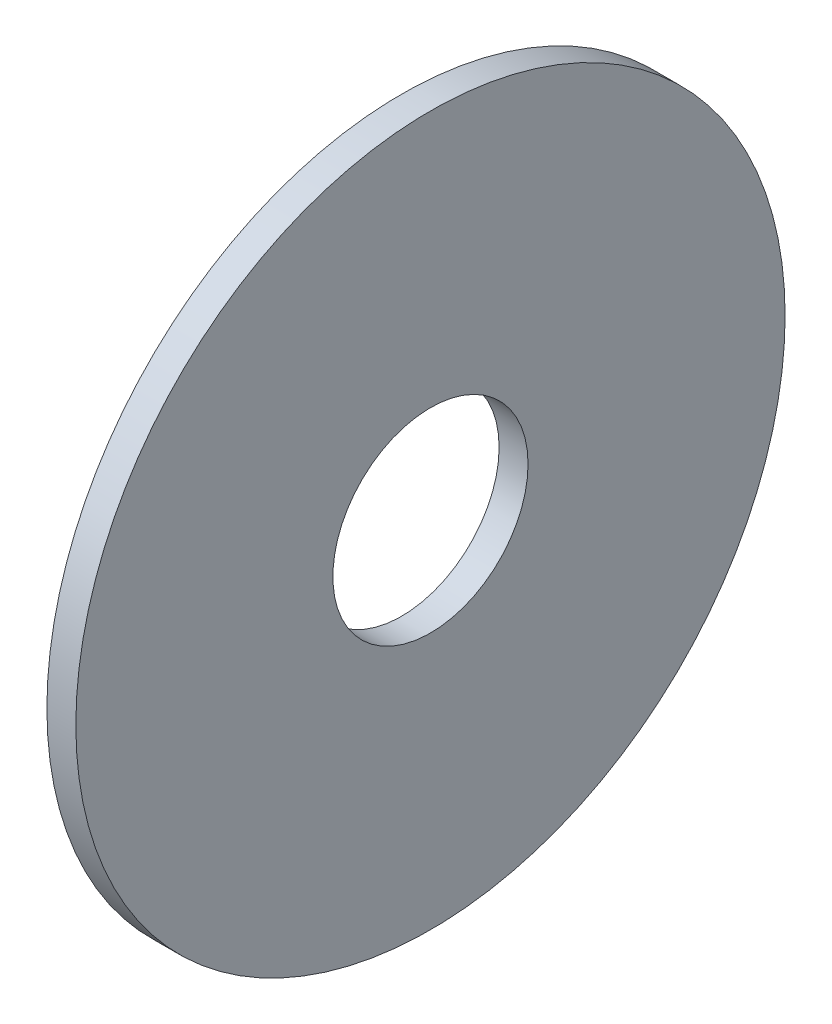
ISO-10303-21;
HEADER;
FILE_DESCRIPTION(('STEP AP214'),'2;1');
FILE_NAME('part.step','',(''),(''),'','','');
FILE_SCHEMA(('AUTOMOTIVE_DESIGN { 1 0 10303 214 1 1 1 1 }'));
ENDSEC;
DATA;
#1=APPLICATION_CONTEXT('core data for automotive mechanical design processes');
#2=APPLICATION_PROTOCOL_DEFINITION('international standard','automotive_design',2000,#1);
#3=PRODUCT_CONTEXT('',#1,'mechanical');
#4=PRODUCT('Part','Part','',(#3));
#5=PRODUCT_RELATED_PRODUCT_CATEGORY('part','',(#4));
#6=PRODUCT_DEFINITION_FORMATION('','',#4);
#7=PRODUCT_DEFINITION_CONTEXT('part definition',#1,'design');
#8=PRODUCT_DEFINITION('design','',#6,#7);
#9=PRODUCT_DEFINITION_SHAPE('','',#8);
#10=(LENGTH_UNIT() NAMED_UNIT(*) SI_UNIT(.MILLI.,.METRE.));
#11=(NAMED_UNIT(*) PLANE_ANGLE_UNIT() SI_UNIT($,.RADIAN.));
#12=(NAMED_UNIT(*) SI_UNIT($,.STERADIAN.) SOLID_ANGLE_UNIT());
#13=UNCERTAINTY_MEASURE_WITH_UNIT(LENGTH_MEASURE(1.E-05),#10,'distance_accuracy_value','');
#14=(GEOMETRIC_REPRESENTATION_CONTEXT(3) GLOBAL_UNCERTAINTY_ASSIGNED_CONTEXT((#13)) GLOBAL_UNIT_ASSIGNED_CONTEXT((#10,
#11,#12)) REPRESENTATION_CONTEXT('',''));
#15=CARTESIAN_POINT('',(0.,0.,0.));
#16=DIRECTION('',(0.,0.,1.));
#17=DIRECTION('',(1.,0.,0.));
#18=AXIS2_PLACEMENT_3D('',#15,#16,#17);
#19=CARTESIAN_POINT('',(1.2954,0.,0.));
#20=DIRECTION('',(1.,0.,0.));
#21=DIRECTION('',(0.,0.,-1.));
#22=AXIS2_PLACEMENT_3D('',#19,#20,#21);
#23=PLANE('',#22);
#24=CARTESIAN_POINT('',(1.2954,0.,0.));
#25=DIRECTION('',(1.,0.,0.));
#26=DIRECTION('',(0.,0.,-1.));
#27=AXIS2_PLACEMENT_3D('',#24,#25,#26);
#28=CIRCLE('',#27,15.875);
#29=CARTESIAN_POINT('',(1.2954,0.,-15.875));
#30=VERTEX_POINT('',#29);
#31=EDGE_CURVE('E10',#30,#30,#28,.T.);
#32=ORIENTED_EDGE('',*,*,#31,.T.);
#33=EDGE_LOOP('',(#32));
#34=FACE_BOUND('',#33,.T.);
#35=CARTESIAN_POINT('',(1.2954,0.,0.));
#36=DIRECTION('',(1.,0.,0.));
#37=DIRECTION('',(0.,0.,-1.));
#38=AXIS2_PLACEMENT_3D('',#35,#36,#37);
#39=CIRCLE('',#38,4.3688);
#40=CARTESIAN_POINT('',(1.2954,0.,-4.3688));
#41=VERTEX_POINT('',#40);
#42=EDGE_CURVE('E41',#41,#41,#39,.T.);
#43=ORIENTED_EDGE('',*,*,#42,.F.);
#44=EDGE_LOOP('',(#43));
#45=FACE_BOUND('',#44,.T.);
#46=ADVANCED_FACE('F30',(#34,#45),#23,.T.);
#47=CARTESIAN_POINT('',(0.,0.,0.));
#48=DIRECTION('',(1.,0.,0.));
#49=DIRECTION('',(0.,0.,-1.));
#50=AXIS2_PLACEMENT_3D('',#47,#48,#49);
#51=PLANE('',#50);
#52=CARTESIAN_POINT('',(0.,0.,0.));
#53=DIRECTION('',(1.,0.,0.));
#54=DIRECTION('',(0.,0.,-1.));
#55=AXIS2_PLACEMENT_3D('',#52,#53,#54);
#56=CIRCLE('',#55,15.875);
#57=CARTESIAN_POINT('',(0.,0.,-15.875));
#58=VERTEX_POINT('',#57);
#59=EDGE_CURVE('E34',#58,#58,#56,.T.);
#60=ORIENTED_EDGE('',*,*,#59,.F.);
#61=EDGE_LOOP('',(#60));
#62=FACE_BOUND('',#61,.T.);
#63=CARTESIAN_POINT('',(0.,0.,0.));
#64=DIRECTION('',(1.,0.,0.));
#65=DIRECTION('',(0.,0.,-1.));
#66=AXIS2_PLACEMENT_3D('',#63,#64,#65);
#67=CIRCLE('',#66,4.3688);
#68=CARTESIAN_POINT('',(0.,0.,-4.3688));
#69=VERTEX_POINT('',#68);
#70=EDGE_CURVE('E43',#69,#69,#67,.T.);
#71=ORIENTED_EDGE('',*,*,#70,.T.);
#72=EDGE_LOOP('',(#71));
#73=FACE_BOUND('',#72,.T.);
#74=ADVANCED_FACE('F53',(#62,#73),#51,.F.);
#75=CARTESIAN_POINT('',(1.2954,0.,0.));
#76=DIRECTION('',(-1.,0.,0.));
#77=DIRECTION('',(0.,0.,1.));
#78=AXIS2_PLACEMENT_3D('',#75,#76,#77);
#79=CYLINDRICAL_SURFACE('',#78,15.875);
#80=ORIENTED_EDGE('',*,*,#31,.F.);
#81=EDGE_LOOP('',(#80));
#82=FACE_BOUND('',#81,.T.);
#83=ORIENTED_EDGE('',*,*,#59,.T.);
#84=EDGE_LOOP('',(#83));
#85=FACE_BOUND('',#84,.T.);
#86=ADVANCED_FACE('F32',(#82,#85),#79,.T.);
#87=CARTESIAN_POINT('',(1.2954,0.,0.));
#88=DIRECTION('',(-1.,0.,0.));
#89=DIRECTION('',(0.,0.,1.));
#90=AXIS2_PLACEMENT_3D('',#87,#88,#89);
#91=CYLINDRICAL_SURFACE('',#90,4.3688);
#92=ORIENTED_EDGE('',*,*,#42,.T.);
#93=EDGE_LOOP('',(#92));
#94=FACE_BOUND('',#93,.T.);
#95=ORIENTED_EDGE('',*,*,#70,.F.);
#96=EDGE_LOOP('',(#95));
#97=FACE_BOUND('',#96,.T.);
#98=ADVANCED_FACE('F49',(#94,#97),#91,.F.);
#99=CLOSED_SHELL('',(#46,#74,#86,#98));
#100=MANIFOLD_SOLID_BREP('B2',#99);
#101=ADVANCED_BREP_SHAPE_REPRESENTATION('',(#18,#100),#14);
#102=SHAPE_DEFINITION_REPRESENTATION(#9,#101);
ENDSEC;
END-ISO-10303-21;
